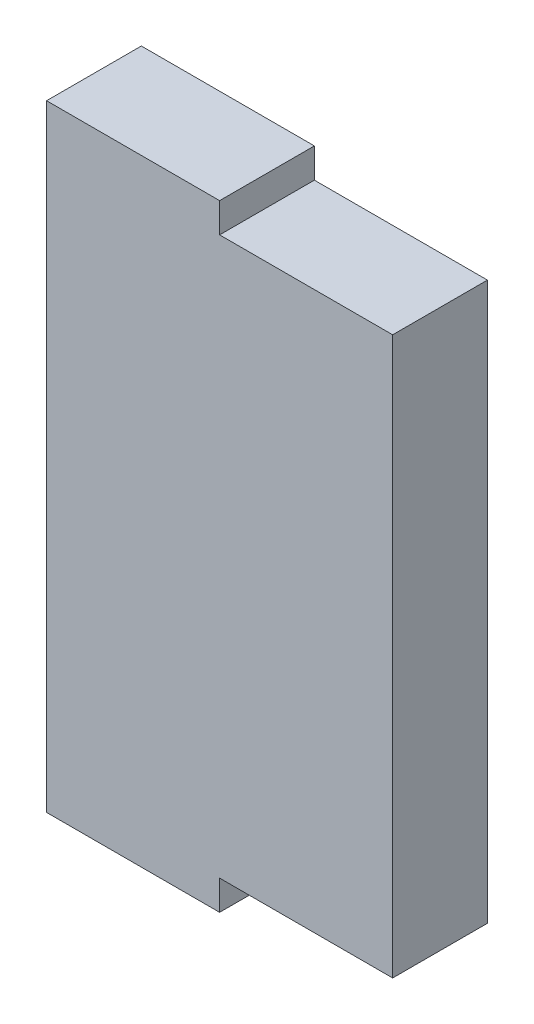
ISO-10303-21;
HEADER;
FILE_DESCRIPTION(('STEP AP214'),'2;1');
FILE_NAME('part.step','',(''),(''),'','','');
FILE_SCHEMA(('AUTOMOTIVE_DESIGN { 1 0 10303 214 1 1 1 1 }'));
ENDSEC;
DATA;
#1=APPLICATION_CONTEXT('core data for automotive mechanical design processes');
#2=APPLICATION_PROTOCOL_DEFINITION('international standard','automotive_design',2000,#1);
#3=PRODUCT_CONTEXT('',#1,'mechanical');
#4=PRODUCT('Part','Part','',(#3));
#5=PRODUCT_RELATED_PRODUCT_CATEGORY('part','',(#4));
#6=PRODUCT_DEFINITION_FORMATION('','',#4);
#7=PRODUCT_DEFINITION_CONTEXT('part definition',#1,'design');
#8=PRODUCT_DEFINITION('design','',#6,#7);
#9=PRODUCT_DEFINITION_SHAPE('','',#8);
#10=(LENGTH_UNIT() NAMED_UNIT(*) SI_UNIT(.MILLI.,.METRE.));
#11=(NAMED_UNIT(*) PLANE_ANGLE_UNIT() SI_UNIT($,.RADIAN.));
#12=(NAMED_UNIT(*) SI_UNIT($,.STERADIAN.) SOLID_ANGLE_UNIT());
#13=UNCERTAINTY_MEASURE_WITH_UNIT(LENGTH_MEASURE(1.E-05),#10,'distance_accuracy_value','');
#14=(GEOMETRIC_REPRESENTATION_CONTEXT(3) GLOBAL_UNCERTAINTY_ASSIGNED_CONTEXT((#13)) GLOBAL_UNIT_ASSIGNED_CONTEXT((#10,
#11,#12)) REPRESENTATION_CONTEXT('',''));
#15=CARTESIAN_POINT('',(0.,0.,0.));
#16=DIRECTION('',(0.,0.,1.));
#17=DIRECTION('',(1.,0.,0.));
#18=AXIS2_PLACEMENT_3D('',#15,#16,#17);
#19=CARTESIAN_POINT('',(1.19348975147204E-12,68.,57.5));
#20=DIRECTION('',(0.,-1.,0.));
#21=DIRECTION('',(0.,0.,-1.));
#22=AXIS2_PLACEMENT_3D('',#19,#20,#21);
#23=PLANE('',#22);
#24=DIRECTION('',(-1.,0.,0.));
#25=VECTOR('',#24,1.);
#26=CARTESIAN_POINT('',(1.19348975147204E-12,68.,0.));
#27=LINE('',#26,#25);
#28=CARTESIAN_POINT('',(1.19348975147204E-12,68.,0.));
#29=VERTEX_POINT('',#28);
#30=CARTESIAN_POINT('',(-104.999999999999,68.,0.));
#31=VERTEX_POINT('',#30);
#32=EDGE_CURVE('E133',#29,#31,#27,.T.);
#33=ORIENTED_EDGE('',*,*,#32,.T.);
#34=DIRECTION('',(0.,0.,-1.));
#35=VECTOR('',#34,1.);
#36=CARTESIAN_POINT('',(-104.999999999999,68.,57.5));
#37=LINE('',#36,#35);
#38=CARTESIAN_POINT('',(-104.999999999999,68.,57.5));
#39=VERTEX_POINT('',#38);
#40=EDGE_CURVE('E11',#39,#31,#37,.T.);
#41=ORIENTED_EDGE('',*,*,#40,.F.);
#42=DIRECTION('',(-1.,0.,0.));
#43=VECTOR('',#42,1.);
#44=CARTESIAN_POINT('',(1.19348975147204E-12,68.,57.5));
#45=LINE('',#44,#43);
#46=CARTESIAN_POINT('',(1.19348975147204E-12,68.,57.5));
#47=VERTEX_POINT('',#46);
#48=EDGE_CURVE('E147',#47,#39,#45,.T.);
#49=ORIENTED_EDGE('',*,*,#48,.F.);
#50=DIRECTION('',(0.,0.,-1.));
#51=VECTOR('',#50,1.);
#52=CARTESIAN_POINT('',(1.19348975147204E-12,68.,57.5));
#53=LINE('',#52,#51);
#54=EDGE_CURVE('E129',#47,#29,#53,.T.);
#55=ORIENTED_EDGE('',*,*,#54,.T.);
#56=EDGE_LOOP('',(#33,#41,#49,#55));
#57=FACE_BOUND('',#56,.T.);
#58=ADVANCED_FACE('F37',(#57),#23,.F.);
#59=CARTESIAN_POINT('',(-104.999999999999,68.,57.5));
#60=DIRECTION('',(1.,0.,0.));
#61=DIRECTION('',(0.,1.,0.));
#62=AXIS2_PLACEMENT_3D('',#59,#60,#61);
#63=PLANE('',#62);
#64=DIRECTION('',(0.,-1.,0.));
#65=VECTOR('',#64,1.);
#66=CARTESIAN_POINT('',(-104.999999999999,68.,0.));
#67=LINE('',#66,#65);
#68=CARTESIAN_POINT('',(-104.999999999999,-306.,0.));
#69=VERTEX_POINT('',#68);
#70=EDGE_CURVE('E136',#31,#69,#67,.T.);
#71=ORIENTED_EDGE('',*,*,#70,.T.);
#72=DIRECTION('',(0.,0.,-1.));
#73=VECTOR('',#72,1.);
#74=CARTESIAN_POINT('',(-104.999999999999,-306.,57.5));
#75=LINE('',#74,#73);
#76=CARTESIAN_POINT('',(-104.999999999999,-306.,57.5));
#77=VERTEX_POINT('',#76);
#78=EDGE_CURVE('E45',#77,#69,#75,.T.);
#79=ORIENTED_EDGE('',*,*,#78,.F.);
#80=DIRECTION('',(0.,-1.,0.));
#81=VECTOR('',#80,1.);
#82=CARTESIAN_POINT('',(-104.999999999999,68.,57.5));
#83=LINE('',#82,#81);
#84=EDGE_CURVE('E96',#39,#77,#83,.T.);
#85=ORIENTED_EDGE('',*,*,#84,.F.);
#86=ORIENTED_EDGE('',*,*,#40,.T.);
#87=EDGE_LOOP('',(#71,#79,#85,#86));
#88=FACE_BOUND('',#87,.T.);
#89=ADVANCED_FACE('F182',(#88),#63,.F.);
#90=CARTESIAN_POINT('',(-104.999999999999,-306.,57.5));
#91=DIRECTION('',(0.,1.,0.));
#92=DIRECTION('',(0.,0.,1.));
#93=AXIS2_PLACEMENT_3D('',#90,#91,#92);
#94=PLANE('',#93);
#95=DIRECTION('',(1.,0.,0.));
#96=VECTOR('',#95,1.);
#97=CARTESIAN_POINT('',(-104.999999999999,-306.,0.));
#98=LINE('',#97,#96);
#99=CARTESIAN_POINT('',(1.18061012526494E-12,-306.,0.));
#100=VERTEX_POINT('',#99);
#101=EDGE_CURVE('E138',#69,#100,#98,.T.);
#102=ORIENTED_EDGE('',*,*,#101,.T.);
#103=DIRECTION('',(0.,0.,-1.));
#104=VECTOR('',#103,1.);
#105=CARTESIAN_POINT('',(1.18061012526494E-12,-306.,57.5));
#106=LINE('',#105,#104);
#107=CARTESIAN_POINT('',(1.18061012526494E-12,-306.,57.5));
#108=VERTEX_POINT('',#107);
#109=EDGE_CURVE('E154',#108,#100,#106,.T.);
#110=ORIENTED_EDGE('',*,*,#109,.F.);
#111=DIRECTION('',(1.,0.,0.));
#112=VECTOR('',#111,1.);
#113=CARTESIAN_POINT('',(-104.999999999999,-306.,57.5));
#114=LINE('',#113,#112);
#115=EDGE_CURVE('E162',#77,#108,#114,.T.);
#116=ORIENTED_EDGE('',*,*,#115,.F.);
#117=ORIENTED_EDGE('',*,*,#78,.T.);
#118=EDGE_LOOP('',(#102,#110,#116,#117));
#119=FACE_BOUND('',#118,.T.);
#120=ADVANCED_FACE('F160',(#119),#94,.F.);
#121=CARTESIAN_POINT('',(1.18061012526494E-12,-306.,57.5));
#122=DIRECTION('',(-1.,0.,0.));
#123=DIRECTION('',(0.,-1.,0.));
#124=AXIS2_PLACEMENT_3D('',#121,#122,#123);
#125=PLANE('',#124);
#126=DIRECTION('',(0.,1.,0.));
#127=VECTOR('',#126,1.);
#128=CARTESIAN_POINT('',(1.18061012526494E-12,-306.,0.));
#129=LINE('',#128,#127);
#130=CARTESIAN_POINT('',(1.18210920140975E-12,-288.,0.));
#131=VERTEX_POINT('',#130);
#132=EDGE_CURVE('E140',#100,#131,#129,.T.);
#133=ORIENTED_EDGE('',*,*,#132,.T.);
#134=DIRECTION('',(0.,0.,-1.));
#135=VECTOR('',#134,1.);
#136=CARTESIAN_POINT('',(1.18210920140975E-12,-288.,57.5));
#137=LINE('',#136,#135);
#138=CARTESIAN_POINT('',(1.18210920140975E-12,-288.,57.5));
#139=VERTEX_POINT('',#138);
#140=EDGE_CURVE('E151',#139,#131,#137,.T.);
#141=ORIENTED_EDGE('',*,*,#140,.F.);
#142=DIRECTION('',(0.,1.,0.));
#143=VECTOR('',#142,1.);
#144=CARTESIAN_POINT('',(1.18061012526494E-12,-306.,57.5));
#145=LINE('',#144,#143);
#146=EDGE_CURVE('E174',#108,#139,#145,.T.);
#147=ORIENTED_EDGE('',*,*,#146,.F.);
#148=ORIENTED_EDGE('',*,*,#109,.T.);
#149=EDGE_LOOP('',(#133,#141,#147,#148));
#150=FACE_BOUND('',#149,.T.);
#151=ADVANCED_FACE('F170',(#150),#125,.F.);
#152=CARTESIAN_POINT('',(1.18210920140975E-12,-288.,57.5));
#153=DIRECTION('',(0.,1.,0.));
#154=DIRECTION('',(0.,0.,1.));
#155=AXIS2_PLACEMENT_3D('',#152,#153,#154);
#156=PLANE('',#155);
#157=DIRECTION('',(1.,0.,0.));
#158=VECTOR('',#157,1.);
#159=CARTESIAN_POINT('',(1.18210920140975E-12,-288.,0.));
#160=LINE('',#159,#158);
#161=CARTESIAN_POINT('',(105.000000000001,-288.,0.));
#162=VERTEX_POINT('',#161);
#163=EDGE_CURVE('E142',#131,#162,#160,.T.);
#164=ORIENTED_EDGE('',*,*,#163,.T.);
#165=DIRECTION('',(0.,0.,-1.));
#166=VECTOR('',#165,1.);
#167=CARTESIAN_POINT('',(105.000000000001,-288.,57.5));
#168=LINE('',#167,#166);
#169=CARTESIAN_POINT('',(105.000000000001,-288.,57.5));
#170=VERTEX_POINT('',#169);
#171=EDGE_CURVE('E124',#170,#162,#168,.T.);
#172=ORIENTED_EDGE('',*,*,#171,.F.);
#173=DIRECTION('',(1.,0.,0.));
#174=VECTOR('',#173,1.);
#175=CARTESIAN_POINT('',(1.18210920140975E-12,-288.,57.5));
#176=LINE('',#175,#174);
#177=EDGE_CURVE('E115',#139,#170,#176,.T.);
#178=ORIENTED_EDGE('',*,*,#177,.F.);
#179=ORIENTED_EDGE('',*,*,#140,.T.);
#180=EDGE_LOOP('',(#164,#172,#178,#179));
#181=FACE_BOUND('',#180,.T.);
#182=ADVANCED_FACE('F173',(#181),#156,.F.);
#183=CARTESIAN_POINT('',(105.000000000001,-288.,57.5));
#184=DIRECTION('',(-1.,0.,0.));
#185=DIRECTION('',(0.,-1.,0.));
#186=AXIS2_PLACEMENT_3D('',#183,#184,#185);
#187=PLANE('',#186);
#188=DIRECTION('',(0.,1.,0.));
#189=VECTOR('',#188,1.);
#190=CARTESIAN_POINT('',(105.000000000001,-288.,0.));
#191=LINE('',#190,#189);
#192=CARTESIAN_POINT('',(105.000000000001,50.,0.));
#193=VERTEX_POINT('',#192);
#194=EDGE_CURVE('E123',#162,#193,#191,.T.);
#195=ORIENTED_EDGE('',*,*,#194,.T.);
#196=DIRECTION('',(0.,0.,-1.));
#197=VECTOR('',#196,1.);
#198=CARTESIAN_POINT('',(105.000000000001,50.,57.5));
#199=LINE('',#198,#197);
#200=CARTESIAN_POINT('',(105.000000000001,50.,57.5));
#201=VERTEX_POINT('',#200);
#202=EDGE_CURVE('E120',#201,#193,#199,.T.);
#203=ORIENTED_EDGE('',*,*,#202,.F.);
#204=DIRECTION('',(0.,1.,0.));
#205=VECTOR('',#204,1.);
#206=CARTESIAN_POINT('',(105.000000000001,-288.,57.5));
#207=LINE('',#206,#205);
#208=EDGE_CURVE('E109',#170,#201,#207,.T.);
#209=ORIENTED_EDGE('',*,*,#208,.F.);
#210=ORIENTED_EDGE('',*,*,#171,.T.);
#211=EDGE_LOOP('',(#195,#203,#209,#210));
#212=FACE_BOUND('',#211,.T.);
#213=ADVANCED_FACE('F121',(#212),#187,.F.);
#214=CARTESIAN_POINT('',(105.000000000001,50.,57.5));
#215=DIRECTION('',(0.,-1.,0.));
#216=DIRECTION('',(0.,0.,-1.));
#217=AXIS2_PLACEMENT_3D('',#214,#215,#216);
#218=PLANE('',#217);
#219=DIRECTION('',(-1.,0.,0.));
#220=VECTOR('',#219,1.);
#221=CARTESIAN_POINT('',(105.000000000001,50.,0.));
#222=LINE('',#221,#220);
#223=CARTESIAN_POINT('',(1.19348975147204E-12,50.,0.));
#224=VERTEX_POINT('',#223);
#225=EDGE_CURVE('E82',#193,#224,#222,.T.);
#226=ORIENTED_EDGE('',*,*,#225,.T.);
#227=DIRECTION('',(0.,0.,-1.));
#228=VECTOR('',#227,1.);
#229=CARTESIAN_POINT('',(1.19348975147204E-12,50.,57.5));
#230=LINE('',#229,#228);
#231=CARTESIAN_POINT('',(1.19348975147204E-12,50.,57.5));
#232=VERTEX_POINT('',#231);
#233=EDGE_CURVE('E125',#232,#224,#230,.T.);
#234=ORIENTED_EDGE('',*,*,#233,.F.);
#235=DIRECTION('',(-1.,0.,0.));
#236=VECTOR('',#235,1.);
#237=CARTESIAN_POINT('',(105.000000000001,50.,57.5));
#238=LINE('',#237,#236);
#239=EDGE_CURVE('E113',#201,#232,#238,.T.);
#240=ORIENTED_EDGE('',*,*,#239,.F.);
#241=ORIENTED_EDGE('',*,*,#202,.T.);
#242=EDGE_LOOP('',(#226,#234,#240,#241));
#243=FACE_BOUND('',#242,.T.);
#244=ADVANCED_FACE('F127',(#243),#218,.F.);
#245=CARTESIAN_POINT('',(1.19348975147204E-12,50.,57.5));
#246=DIRECTION('',(-1.,0.,0.));
#247=DIRECTION('',(0.,0.,1.));
#248=AXIS2_PLACEMENT_3D('',#245,#246,#247);
#249=PLANE('',#248);
#250=DIRECTION('',(0.,1.,0.));
#251=VECTOR('',#250,1.);
#252=CARTESIAN_POINT('',(1.19348975147204E-12,50.,0.));
#253=LINE('',#252,#251);
#254=EDGE_CURVE('E88',#224,#29,#253,.T.);
#255=ORIENTED_EDGE('',*,*,#254,.T.);
#256=ORIENTED_EDGE('',*,*,#54,.F.);
#257=DIRECTION('',(0.,1.,0.));
#258=VECTOR('',#257,1.);
#259=CARTESIAN_POINT('',(1.19348975147204E-12,50.,57.5));
#260=LINE('',#259,#258);
#261=EDGE_CURVE('E53',#232,#47,#260,.T.);
#262=ORIENTED_EDGE('',*,*,#261,.F.);
#263=ORIENTED_EDGE('',*,*,#233,.T.);
#264=EDGE_LOOP('',(#255,#256,#262,#263));
#265=FACE_BOUND('',#264,.T.);
#266=ADVANCED_FACE('F198',(#265),#249,.F.);
#267=CARTESIAN_POINT('',(0.,0.,57.5));
#268=DIRECTION('',(0.,0.,1.));
#269=DIRECTION('',(1.,0.,0.));
#270=AXIS2_PLACEMENT_3D('',#267,#268,#269);
#271=PLANE('',#270);
#272=ORIENTED_EDGE('',*,*,#48,.T.);
#273=ORIENTED_EDGE('',*,*,#84,.T.);
#274=ORIENTED_EDGE('',*,*,#115,.T.);
#275=ORIENTED_EDGE('',*,*,#146,.T.);
#276=ORIENTED_EDGE('',*,*,#177,.T.);
#277=ORIENTED_EDGE('',*,*,#208,.T.);
#278=ORIENTED_EDGE('',*,*,#239,.T.);
#279=ORIENTED_EDGE('',*,*,#261,.T.);
#280=EDGE_LOOP('',(#272,#273,#274,#275,#276,#277,#278,#279));
#281=FACE_BOUND('',#280,.T.);
#282=ADVANCED_FACE('F111',(#281),#271,.T.);
#283=CARTESIAN_POINT('',(0.,0.,0.));
#284=DIRECTION('',(0.,0.,1.));
#285=DIRECTION('',(1.,0.,0.));
#286=AXIS2_PLACEMENT_3D('',#283,#284,#285);
#287=PLANE('',#286);
#288=ORIENTED_EDGE('',*,*,#32,.F.);
#289=ORIENTED_EDGE('',*,*,#254,.F.);
#290=ORIENTED_EDGE('',*,*,#225,.F.);
#291=ORIENTED_EDGE('',*,*,#194,.F.);
#292=ORIENTED_EDGE('',*,*,#163,.F.);
#293=ORIENTED_EDGE('',*,*,#132,.F.);
#294=ORIENTED_EDGE('',*,*,#101,.F.);
#295=ORIENTED_EDGE('',*,*,#70,.F.);
#296=EDGE_LOOP('',(#288,#289,#290,#291,#292,#293,#294,#295));
#297=FACE_BOUND('',#296,.T.);
#298=ADVANCED_FACE('F166',(#297),#287,.F.);
#299=CLOSED_SHELL('',(#58,#89,#120,#151,#182,#213,#244,#266,#282,#298));
#300=MANIFOLD_SOLID_BREP('B2',#299);
#301=ADVANCED_BREP_SHAPE_REPRESENTATION('',(#18,#300),#14);
#302=SHAPE_DEFINITION_REPRESENTATION(#9,#301);
ENDSEC;
END-ISO-10303-21;
